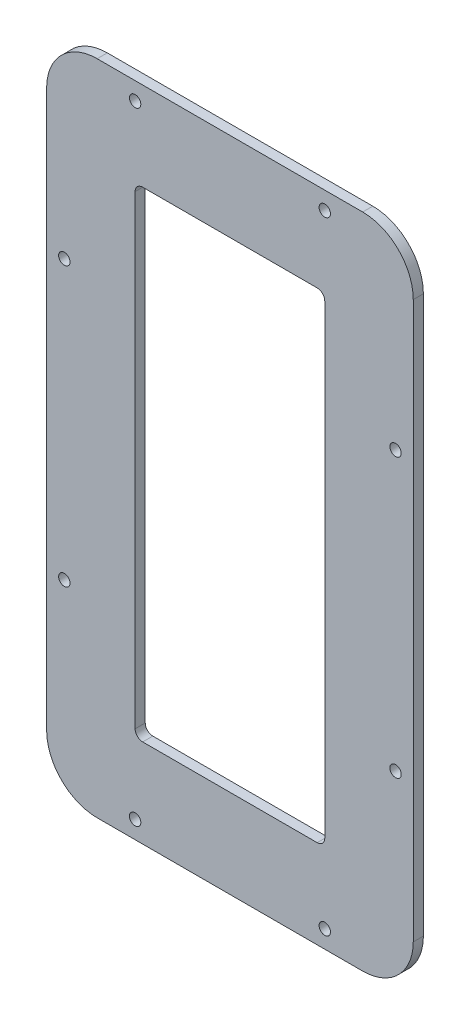
ISO-10303-21;
HEADER;
FILE_DESCRIPTION(('STEP AP214'),'2;1');
FILE_NAME('part.step','',(''),(''),'','','');
FILE_SCHEMA(('AUTOMOTIVE_DESIGN { 1 0 10303 214 1 1 1 1 }'));
ENDSEC;
DATA;
#1=APPLICATION_CONTEXT('core data for automotive mechanical design processes');
#2=APPLICATION_PROTOCOL_DEFINITION('international standard','automotive_design',2000,#1);
#3=PRODUCT_CONTEXT('',#1,'mechanical');
#4=PRODUCT('Part','Part','',(#3));
#5=PRODUCT_RELATED_PRODUCT_CATEGORY('part','',(#4));
#6=PRODUCT_DEFINITION_FORMATION('','',#4);
#7=PRODUCT_DEFINITION_CONTEXT('part definition',#1,'design');
#8=PRODUCT_DEFINITION('design','',#6,#7);
#9=PRODUCT_DEFINITION_SHAPE('','',#8);
#10=(LENGTH_UNIT() NAMED_UNIT(*) SI_UNIT(.MILLI.,.METRE.));
#11=(NAMED_UNIT(*) PLANE_ANGLE_UNIT() SI_UNIT($,.RADIAN.));
#12=(NAMED_UNIT(*) SI_UNIT($,.STERADIAN.) SOLID_ANGLE_UNIT());
#13=UNCERTAINTY_MEASURE_WITH_UNIT(LENGTH_MEASURE(1.E-05),#10,'distance_accuracy_value','');
#14=(GEOMETRIC_REPRESENTATION_CONTEXT(3) GLOBAL_UNCERTAINTY_ASSIGNED_CONTEXT((#13)) GLOBAL_UNIT_ASSIGNED_CONTEXT((#10,
#11,#12)) REPRESENTATION_CONTEXT('',''));
#15=CARTESIAN_POINT('',(0.,0.,0.));
#16=DIRECTION('',(0.,0.,1.));
#17=DIRECTION('',(1.,0.,0.));
#18=AXIS2_PLACEMENT_3D('',#15,#16,#17);
#19=CARTESIAN_POINT('',(72.5,130.,4.));
#20=DIRECTION('',(0.,0.,-1.));
#21=DIRECTION('',(-1.,0.,0.));
#22=AXIS2_PLACEMENT_3D('',#19,#20,#21);
#23=PLANE('',#22);
#24=CARTESIAN_POINT('',(37.5,123.,4.));
#25=DIRECTION('',(0.,0.,1.));
#26=DIRECTION('',(1.,0.,0.));
#27=AXIS2_PLACEMENT_3D('',#24,#25,#26);
#28=CIRCLE('',#27,2.24999999999999);
#29=CARTESIAN_POINT('',(39.75,123.,4.));
#30=VERTEX_POINT('',#29);
#31=EDGE_CURVE('E597',#30,#30,#28,.T.);
#32=ORIENTED_EDGE('',*,*,#31,.F.);
#33=EDGE_LOOP('',(#32));
#34=FACE_BOUND('',#33,.T.);
#35=CARTESIAN_POINT('',(65.5000000000001,-55.,4.));
#36=DIRECTION('',(0.,0.,1.));
#37=DIRECTION('',(1.,0.,0.));
#38=AXIS2_PLACEMENT_3D('',#35,#36,#37);
#39=CIRCLE('',#38,2.24999999999999);
#40=CARTESIAN_POINT('',(67.7500000000001,-55.,4.));
#41=VERTEX_POINT('',#40);
#42=EDGE_CURVE('E585',#41,#41,#39,.T.);
#43=ORIENTED_EDGE('',*,*,#42,.F.);
#44=EDGE_LOOP('',(#43));
#45=FACE_BOUND('',#44,.T.);
#46=CARTESIAN_POINT('',(-37.5,-123.,4.));
#47=DIRECTION('',(0.,0.,1.));
#48=DIRECTION('',(1.,0.,0.));
#49=AXIS2_PLACEMENT_3D('',#46,#47,#48);
#50=CIRCLE('',#49,2.24999999999999);
#51=CARTESIAN_POINT('',(-35.25,-123.,4.));
#52=VERTEX_POINT('',#51);
#53=EDGE_CURVE('E573',#52,#52,#50,.T.);
#54=ORIENTED_EDGE('',*,*,#53,.F.);
#55=EDGE_LOOP('',(#54));
#56=FACE_BOUND('',#55,.T.);
#57=CARTESIAN_POINT('',(-65.5,55.,4.));
#58=DIRECTION('',(0.,0.,1.));
#59=DIRECTION('',(1.,0.,0.));
#60=AXIS2_PLACEMENT_3D('',#57,#58,#59);
#61=CIRCLE('',#60,2.24999999999999);
#62=CARTESIAN_POINT('',(-63.25,55.,4.));
#63=VERTEX_POINT('',#62);
#64=EDGE_CURVE('E558',#63,#63,#61,.T.);
#65=ORIENTED_EDGE('',*,*,#64,.F.);
#66=EDGE_LOOP('',(#65));
#67=FACE_BOUND('',#66,.T.);
#68=DIRECTION('',(1.,0.,0.));
#69=VECTOR('',#68,1.);
#70=CARTESIAN_POINT('',(-72.5,-130.,4.));
#71=LINE('',#70,#69);
#72=CARTESIAN_POINT('',(-52.5,-130.,4.));
#73=VERTEX_POINT('',#72);
#74=CARTESIAN_POINT('',(52.5,-130.,4.));
#75=VERTEX_POINT('',#74);
#76=EDGE_CURVE('E228',#73,#75,#71,.T.);
#77=ORIENTED_EDGE('',*,*,#76,.T.);
#78=CARTESIAN_POINT('',(52.5,-110.,4.));
#79=DIRECTION('',(0.,0.,-1.));
#80=DIRECTION('',(-1.,0.,0.));
#81=AXIS2_PLACEMENT_3D('',#78,#79,#80);
#82=CIRCLE('',#81,20.);
#83=CARTESIAN_POINT('',(72.5,-110.,4.));
#84=VERTEX_POINT('',#83);
#85=EDGE_CURVE('E263',#75,#84,#82,.F.);
#86=ORIENTED_EDGE('',*,*,#85,.T.);
#87=DIRECTION('',(0.,1.,0.));
#88=VECTOR('',#87,1.);
#89=CARTESIAN_POINT('',(72.5,-130.,4.));
#90=LINE('',#89,#88);
#91=CARTESIAN_POINT('',(72.5,110.,4.));
#92=VERTEX_POINT('',#91);
#93=EDGE_CURVE('E220',#84,#92,#90,.T.);
#94=ORIENTED_EDGE('',*,*,#93,.T.);
#95=CARTESIAN_POINT('',(52.5,110.,4.));
#96=DIRECTION('',(0.,0.,-1.));
#97=DIRECTION('',(-1.,0.,0.));
#98=AXIS2_PLACEMENT_3D('',#95,#96,#97);
#99=CIRCLE('',#98,20.);
#100=CARTESIAN_POINT('',(52.5,130.,4.));
#101=VERTEX_POINT('',#100);
#102=EDGE_CURVE('E259',#92,#101,#99,.F.);
#103=ORIENTED_EDGE('',*,*,#102,.T.);
#104=DIRECTION('',(-1.,0.,0.));
#105=VECTOR('',#104,1.);
#106=CARTESIAN_POINT('',(-72.5,130.,4.));
#107=LINE('',#106,#105);
#108=CARTESIAN_POINT('',(-52.5,130.,4.));
#109=VERTEX_POINT('',#108);
#110=EDGE_CURVE('E223',#101,#109,#107,.T.);
#111=ORIENTED_EDGE('',*,*,#110,.T.);
#112=CARTESIAN_POINT('',(-52.5,110.,4.));
#113=DIRECTION('',(0.,0.,-1.));
#114=DIRECTION('',(-1.,0.,0.));
#115=AXIS2_PLACEMENT_3D('',#112,#113,#114);
#116=CIRCLE('',#115,20.);
#117=CARTESIAN_POINT('',(-72.5,110.,4.));
#118=VERTEX_POINT('',#117);
#119=EDGE_CURVE('E53',#109,#118,#116,.F.);
#120=ORIENTED_EDGE('',*,*,#119,.T.);
#121=DIRECTION('',(0.,-1.,0.));
#122=VECTOR('',#121,1.);
#123=CARTESIAN_POINT('',(-72.5,-130.,4.));
#124=LINE('',#123,#122);
#125=CARTESIAN_POINT('',(-72.5,-110.,4.));
#126=VERTEX_POINT('',#125);
#127=EDGE_CURVE('E226',#118,#126,#124,.T.);
#128=ORIENTED_EDGE('',*,*,#127,.T.);
#129=CARTESIAN_POINT('',(-52.5,-110.,4.));
#130=DIRECTION('',(0.,0.,-1.));
#131=DIRECTION('',(-1.,0.,0.));
#132=AXIS2_PLACEMENT_3D('',#129,#130,#131);
#133=CIRCLE('',#132,20.);
#134=EDGE_CURVE('E261',#126,#73,#133,.F.);
#135=ORIENTED_EDGE('',*,*,#134,.T.);
#136=EDGE_LOOP('',(#77,#86,#94,#103,#111,#120,#128,#135));
#137=FACE_BOUND('',#136,.T.);
#138=CARTESIAN_POINT('',(-34.5,92.,4.));
#139=DIRECTION('',(0.,0.,1.));
#140=DIRECTION('',(1.,0.,0.));
#141=AXIS2_PLACEMENT_3D('',#138,#139,#140);
#142=CIRCLE('',#141,3.);
#143=CARTESIAN_POINT('',(-34.5,95.,4.));
#144=VERTEX_POINT('',#143);
#145=CARTESIAN_POINT('',(-37.5,92.,4.));
#146=VERTEX_POINT('',#145);
#147=EDGE_CURVE('E147',#144,#146,#142,.T.);
#148=ORIENTED_EDGE('',*,*,#147,.F.);
#149=DIRECTION('',(-1.,0.,0.));
#150=VECTOR('',#149,1.);
#151=CARTESIAN_POINT('',(-34.5,95.,4.));
#152=LINE('',#151,#150);
#153=CARTESIAN_POINT('',(34.5,95.,4.));
#154=VERTEX_POINT('',#153);
#155=EDGE_CURVE('E185',#154,#144,#152,.T.);
#156=ORIENTED_EDGE('',*,*,#155,.F.);
#157=CARTESIAN_POINT('',(34.5,92.,4.));
#158=DIRECTION('',(0.,0.,1.));
#159=DIRECTION('',(1.,0.,0.));
#160=AXIS2_PLACEMENT_3D('',#157,#158,#159);
#161=CIRCLE('',#160,3.);
#162=CARTESIAN_POINT('',(37.5,92.,4.));
#163=VERTEX_POINT('',#162);
#164=EDGE_CURVE('E182',#163,#154,#161,.T.);
#165=ORIENTED_EDGE('',*,*,#164,.F.);
#166=DIRECTION('',(0.,1.,0.));
#167=VECTOR('',#166,1.);
#168=CARTESIAN_POINT('',(37.5,-92.,4.));
#169=LINE('',#168,#167);
#170=CARTESIAN_POINT('',(37.5,-92.,4.));
#171=VERTEX_POINT('',#170);
#172=EDGE_CURVE('E180',#171,#163,#169,.T.);
#173=ORIENTED_EDGE('',*,*,#172,.F.);
#174=CARTESIAN_POINT('',(34.5,-92.,4.));
#175=DIRECTION('',(0.,0.,1.));
#176=DIRECTION('',(1.,0.,0.));
#177=AXIS2_PLACEMENT_3D('',#174,#175,#176);
#178=CIRCLE('',#177,3.);
#179=CARTESIAN_POINT('',(34.5,-95.,4.));
#180=VERTEX_POINT('',#179);
#181=EDGE_CURVE('E178',#180,#171,#178,.T.);
#182=ORIENTED_EDGE('',*,*,#181,.F.);
#183=DIRECTION('',(1.,0.,0.));
#184=VECTOR('',#183,1.);
#185=CARTESIAN_POINT('',(-34.5,-95.,4.));
#186=LINE('',#185,#184);
#187=CARTESIAN_POINT('',(-34.5,-95.,4.));
#188=VERTEX_POINT('',#187);
#189=EDGE_CURVE('E173',#188,#180,#186,.T.);
#190=ORIENTED_EDGE('',*,*,#189,.F.);
#191=CARTESIAN_POINT('',(-34.5,-92.,4.));
#192=DIRECTION('',(0.,0.,1.));
#193=DIRECTION('',(1.,0.,0.));
#194=AXIS2_PLACEMENT_3D('',#191,#192,#193);
#195=CIRCLE('',#194,3.);
#196=CARTESIAN_POINT('',(-37.5,-92.,4.));
#197=VERTEX_POINT('',#196);
#198=EDGE_CURVE('E171',#197,#188,#195,.T.);
#199=ORIENTED_EDGE('',*,*,#198,.F.);
#200=DIRECTION('',(0.,-1.,0.));
#201=VECTOR('',#200,1.);
#202=CARTESIAN_POINT('',(-37.5,-92.,4.));
#203=LINE('',#202,#201);
#204=EDGE_CURVE('E157',#146,#197,#203,.T.);
#205=ORIENTED_EDGE('',*,*,#204,.F.);
#206=EDGE_LOOP('',(#148,#156,#165,#173,#182,#190,#199,#205));
#207=FACE_BOUND('',#206,.T.);
#208=CARTESIAN_POINT('',(-65.5,-55.,4.));
#209=DIRECTION('',(0.,0.,1.));
#210=DIRECTION('',(1.,0.,0.));
#211=AXIS2_PLACEMENT_3D('',#208,#209,#210);
#212=CIRCLE('',#211,2.24999999999999);
#213=CARTESIAN_POINT('',(-63.25,-55.,4.));
#214=VERTEX_POINT('',#213);
#215=EDGE_CURVE('E567',#214,#214,#212,.T.);
#216=ORIENTED_EDGE('',*,*,#215,.F.);
#217=EDGE_LOOP('',(#216));
#218=FACE_BOUND('',#217,.T.);
#219=CARTESIAN_POINT('',(37.5,-123.,4.));
#220=DIRECTION('',(0.,0.,1.));
#221=DIRECTION('',(1.,0.,0.));
#222=AXIS2_PLACEMENT_3D('',#219,#220,#221);
#223=CIRCLE('',#222,2.24999999999999);
#224=CARTESIAN_POINT('',(39.75,-123.,4.));
#225=VERTEX_POINT('',#224);
#226=EDGE_CURVE('E579',#225,#225,#223,.T.);
#227=ORIENTED_EDGE('',*,*,#226,.F.);
#228=EDGE_LOOP('',(#227));
#229=FACE_BOUND('',#228,.T.);
#230=CARTESIAN_POINT('',(65.5000000000001,55.,4.));
#231=DIRECTION('',(0.,0.,1.));
#232=DIRECTION('',(1.,0.,0.));
#233=AXIS2_PLACEMENT_3D('',#230,#231,#232);
#234=CIRCLE('',#233,2.24999999999999);
#235=CARTESIAN_POINT('',(67.75,55.,4.));
#236=VERTEX_POINT('',#235);
#237=EDGE_CURVE('E591',#236,#236,#234,.T.);
#238=ORIENTED_EDGE('',*,*,#237,.F.);
#239=EDGE_LOOP('',(#238));
#240=FACE_BOUND('',#239,.T.);
#241=CARTESIAN_POINT('',(-37.5,123.,4.));
#242=DIRECTION('',(0.,0.,1.));
#243=DIRECTION('',(1.,0.,0.));
#244=AXIS2_PLACEMENT_3D('',#241,#242,#243);
#245=CIRCLE('',#244,2.24999999999999);
#246=CARTESIAN_POINT('',(-35.25,123.,4.));
#247=VERTEX_POINT('',#246);
#248=EDGE_CURVE('E603',#247,#247,#245,.T.);
#249=ORIENTED_EDGE('',*,*,#248,.F.);
#250=EDGE_LOOP('',(#249));
#251=FACE_BOUND('',#250,.T.);
#252=ADVANCED_FACE('F31',(#34,#45,#56,#67,#137,#207,#218,#229,#240,#251),#23,.F.);
#253=CARTESIAN_POINT('',(72.5,130.,0.));
#254=DIRECTION('',(0.,0.,-1.));
#255=DIRECTION('',(-1.,0.,0.));
#256=AXIS2_PLACEMENT_3D('',#253,#254,#255);
#257=PLANE('',#256);
#258=CARTESIAN_POINT('',(-37.5,123.,0.));
#259=DIRECTION('',(0.,0.,-1.));
#260=DIRECTION('',(-1.,0.,0.));
#261=AXIS2_PLACEMENT_3D('',#258,#259,#260);
#262=CIRCLE('',#261,2.25);
#263=CARTESIAN_POINT('',(-39.75,123.,0.));
#264=VERTEX_POINT('',#263);
#265=EDGE_CURVE('E600',#264,#264,#262,.T.);
#266=ORIENTED_EDGE('',*,*,#265,.F.);
#267=EDGE_LOOP('',(#266));
#268=FACE_BOUND('',#267,.T.);
#269=CARTESIAN_POINT('',(37.5,123.,0.));
#270=DIRECTION('',(0.,0.,-1.));
#271=DIRECTION('',(-1.,0.,0.));
#272=AXIS2_PLACEMENT_3D('',#269,#270,#271);
#273=CIRCLE('',#272,2.25);
#274=CARTESIAN_POINT('',(35.25,123.,0.));
#275=VERTEX_POINT('',#274);
#276=EDGE_CURVE('E594',#275,#275,#273,.T.);
#277=ORIENTED_EDGE('',*,*,#276,.F.);
#278=EDGE_LOOP('',(#277));
#279=FACE_BOUND('',#278,.T.);
#280=CARTESIAN_POINT('',(65.5000000000001,55.,0.));
#281=DIRECTION('',(0.,0.,-1.));
#282=DIRECTION('',(-1.,0.,0.));
#283=AXIS2_PLACEMENT_3D('',#280,#281,#282);
#284=CIRCLE('',#283,2.25);
#285=CARTESIAN_POINT('',(63.2500000000001,55.,0.));
#286=VERTEX_POINT('',#285);
#287=EDGE_CURVE('E588',#286,#286,#284,.T.);
#288=ORIENTED_EDGE('',*,*,#287,.F.);
#289=EDGE_LOOP('',(#288));
#290=FACE_BOUND('',#289,.T.);
#291=CARTESIAN_POINT('',(65.5000000000001,-55.,0.));
#292=DIRECTION('',(0.,0.,-1.));
#293=DIRECTION('',(-1.,0.,0.));
#294=AXIS2_PLACEMENT_3D('',#291,#292,#293);
#295=CIRCLE('',#294,2.25);
#296=CARTESIAN_POINT('',(63.2500000000001,-55.,0.));
#297=VERTEX_POINT('',#296);
#298=EDGE_CURVE('E582',#297,#297,#295,.T.);
#299=ORIENTED_EDGE('',*,*,#298,.F.);
#300=EDGE_LOOP('',(#299));
#301=FACE_BOUND('',#300,.T.);
#302=CARTESIAN_POINT('',(37.5,-123.,0.));
#303=DIRECTION('',(0.,0.,-1.));
#304=DIRECTION('',(-1.,0.,0.));
#305=AXIS2_PLACEMENT_3D('',#302,#303,#304);
#306=CIRCLE('',#305,2.25);
#307=CARTESIAN_POINT('',(35.25,-123.,0.));
#308=VERTEX_POINT('',#307);
#309=EDGE_CURVE('E576',#308,#308,#306,.T.);
#310=ORIENTED_EDGE('',*,*,#309,.F.);
#311=EDGE_LOOP('',(#310));
#312=FACE_BOUND('',#311,.T.);
#313=CARTESIAN_POINT('',(-37.5,-123.,0.));
#314=DIRECTION('',(0.,0.,-1.));
#315=DIRECTION('',(-1.,0.,0.));
#316=AXIS2_PLACEMENT_3D('',#313,#314,#315);
#317=CIRCLE('',#316,2.25);
#318=CARTESIAN_POINT('',(-39.75,-123.,0.));
#319=VERTEX_POINT('',#318);
#320=EDGE_CURVE('E570',#319,#319,#317,.T.);
#321=ORIENTED_EDGE('',*,*,#320,.F.);
#322=EDGE_LOOP('',(#321));
#323=FACE_BOUND('',#322,.T.);
#324=CARTESIAN_POINT('',(-65.5,-55.,0.));
#325=DIRECTION('',(0.,0.,-1.));
#326=DIRECTION('',(-1.,0.,0.));
#327=AXIS2_PLACEMENT_3D('',#324,#325,#326);
#328=CIRCLE('',#327,2.25);
#329=CARTESIAN_POINT('',(-67.75,-55.,0.));
#330=VERTEX_POINT('',#329);
#331=EDGE_CURVE('E562',#330,#330,#328,.T.);
#332=ORIENTED_EDGE('',*,*,#331,.F.);
#333=EDGE_LOOP('',(#332));
#334=FACE_BOUND('',#333,.T.);
#335=CARTESIAN_POINT('',(-65.5,55.,0.));
#336=DIRECTION('',(0.,0.,-1.));
#337=DIRECTION('',(-1.,0.,0.));
#338=AXIS2_PLACEMENT_3D('',#335,#336,#337);
#339=CIRCLE('',#338,2.25);
#340=CARTESIAN_POINT('',(-67.75,55.,0.));
#341=VERTEX_POINT('',#340);
#342=EDGE_CURVE('E189',#341,#341,#339,.T.);
#343=ORIENTED_EDGE('',*,*,#342,.F.);
#344=EDGE_LOOP('',(#343));
#345=FACE_BOUND('',#344,.T.);
#346=DIRECTION('',(0.,1.,0.));
#347=VECTOR('',#346,1.);
#348=CARTESIAN_POINT('',(72.5,-130.,0.));
#349=LINE('',#348,#347);
#350=CARTESIAN_POINT('',(72.5,-110.,0.));
#351=VERTEX_POINT('',#350);
#352=CARTESIAN_POINT('',(72.5,110.,0.));
#353=VERTEX_POINT('',#352);
#354=EDGE_CURVE('E165',#351,#353,#349,.T.);
#355=ORIENTED_EDGE('',*,*,#354,.F.);
#356=CARTESIAN_POINT('',(52.5,-110.,0.));
#357=DIRECTION('',(0.,0.,-1.));
#358=DIRECTION('',(-1.,0.,0.));
#359=AXIS2_PLACEMENT_3D('',#356,#357,#358);
#360=CIRCLE('',#359,20.);
#361=CARTESIAN_POINT('',(52.5,-130.,0.));
#362=VERTEX_POINT('',#361);
#363=EDGE_CURVE('E251',#351,#362,#360,.T.);
#364=ORIENTED_EDGE('',*,*,#363,.T.);
#365=DIRECTION('',(1.,0.,0.));
#366=VECTOR('',#365,1.);
#367=CARTESIAN_POINT('',(-72.5,-130.,0.));
#368=LINE('',#367,#366);
#369=CARTESIAN_POINT('',(-52.5,-130.,0.));
#370=VERTEX_POINT('',#369);
#371=EDGE_CURVE('E224',#370,#362,#368,.T.);
#372=ORIENTED_EDGE('',*,*,#371,.F.);
#373=CARTESIAN_POINT('',(-52.5,-110.,0.));
#374=DIRECTION('',(0.,0.,-1.));
#375=DIRECTION('',(-1.,0.,0.));
#376=AXIS2_PLACEMENT_3D('',#373,#374,#375);
#377=CIRCLE('',#376,20.);
#378=CARTESIAN_POINT('',(-72.5,-110.,0.));
#379=VERTEX_POINT('',#378);
#380=EDGE_CURVE('E249',#370,#379,#377,.T.);
#381=ORIENTED_EDGE('',*,*,#380,.T.);
#382=DIRECTION('',(0.,-1.,0.));
#383=VECTOR('',#382,1.);
#384=CARTESIAN_POINT('',(-72.5,-130.,0.));
#385=LINE('',#384,#383);
#386=CARTESIAN_POINT('',(-72.5,110.,0.));
#387=VERTEX_POINT('',#386);
#388=EDGE_CURVE('E237',#387,#379,#385,.T.);
#389=ORIENTED_EDGE('',*,*,#388,.F.);
#390=CARTESIAN_POINT('',(-52.5,110.,0.));
#391=DIRECTION('',(0.,0.,-1.));
#392=DIRECTION('',(-1.,0.,0.));
#393=AXIS2_PLACEMENT_3D('',#390,#391,#392);
#394=CIRCLE('',#393,20.);
#395=CARTESIAN_POINT('',(-52.5,130.,0.));
#396=VERTEX_POINT('',#395);
#397=EDGE_CURVE('E245',#387,#396,#394,.T.);
#398=ORIENTED_EDGE('',*,*,#397,.T.);
#399=DIRECTION('',(-1.,0.,0.));
#400=VECTOR('',#399,1.);
#401=CARTESIAN_POINT('',(-72.5,130.,0.));
#402=LINE('',#401,#400);
#403=CARTESIAN_POINT('',(52.5,130.,0.));
#404=VERTEX_POINT('',#403);
#405=EDGE_CURVE('E234',#404,#396,#402,.T.);
#406=ORIENTED_EDGE('',*,*,#405,.F.);
#407=CARTESIAN_POINT('',(52.5,110.,0.));
#408=DIRECTION('',(0.,0.,-1.));
#409=DIRECTION('',(-1.,0.,0.));
#410=AXIS2_PLACEMENT_3D('',#407,#408,#409);
#411=CIRCLE('',#410,20.);
#412=EDGE_CURVE('E247',#404,#353,#411,.T.);
#413=ORIENTED_EDGE('',*,*,#412,.T.);
#414=EDGE_LOOP('',(#355,#364,#372,#381,#389,#398,#406,#413));
#415=FACE_BOUND('',#414,.T.);
#416=DIRECTION('',(-1.,0.,0.));
#417=VECTOR('',#416,1.);
#418=CARTESIAN_POINT('',(-34.5,95.,0.));
#419=LINE('',#418,#417);
#420=CARTESIAN_POINT('',(34.5,95.,0.));
#421=VERTEX_POINT('',#420);
#422=CARTESIAN_POINT('',(-34.5,95.,0.));
#423=VERTEX_POINT('',#422);
#424=EDGE_CURVE('E158',#421,#423,#419,.T.);
#425=ORIENTED_EDGE('',*,*,#424,.T.);
#426=CARTESIAN_POINT('',(-34.5,92.,0.));
#427=DIRECTION('',(0.,0.,1.));
#428=DIRECTION('',(1.,0.,0.));
#429=AXIS2_PLACEMENT_3D('',#426,#427,#428);
#430=CIRCLE('',#429,3.);
#431=CARTESIAN_POINT('',(-37.5,92.,0.));
#432=VERTEX_POINT('',#431);
#433=EDGE_CURVE('E187',#423,#432,#430,.T.);
#434=ORIENTED_EDGE('',*,*,#433,.T.);
#435=DIRECTION('',(0.,-1.,0.));
#436=VECTOR('',#435,1.);
#437=CARTESIAN_POINT('',(-37.5,-92.,0.));
#438=LINE('',#437,#436);
#439=CARTESIAN_POINT('',(-37.5,-92.,0.));
#440=VERTEX_POINT('',#439);
#441=EDGE_CURVE('E164',#432,#440,#438,.T.);
#442=ORIENTED_EDGE('',*,*,#441,.T.);
#443=CARTESIAN_POINT('',(-34.5,-92.,0.));
#444=DIRECTION('',(0.,0.,1.));
#445=DIRECTION('',(1.,0.,0.));
#446=AXIS2_PLACEMENT_3D('',#443,#444,#445);
#447=CIRCLE('',#446,3.);
#448=CARTESIAN_POINT('',(-34.5,-95.,0.));
#449=VERTEX_POINT('',#448);
#450=EDGE_CURVE('E191',#440,#449,#447,.T.);
#451=ORIENTED_EDGE('',*,*,#450,.T.);
#452=DIRECTION('',(1.,0.,0.));
#453=VECTOR('',#452,1.);
#454=CARTESIAN_POINT('',(-34.5,-95.,0.));
#455=LINE('',#454,#453);
#456=CARTESIAN_POINT('',(34.5,-95.,0.));
#457=VERTEX_POINT('',#456);
#458=EDGE_CURVE('E194',#449,#457,#455,.T.);
#459=ORIENTED_EDGE('',*,*,#458,.T.);
#460=CARTESIAN_POINT('',(34.5,-92.,0.));
#461=DIRECTION('',(0.,0.,1.));
#462=DIRECTION('',(1.,0.,0.));
#463=AXIS2_PLACEMENT_3D('',#460,#461,#462);
#464=CIRCLE('',#463,3.);
#465=CARTESIAN_POINT('',(37.5,-92.,0.));
#466=VERTEX_POINT('',#465);
#467=EDGE_CURVE('E197',#457,#466,#464,.T.);
#468=ORIENTED_EDGE('',*,*,#467,.T.);
#469=DIRECTION('',(0.,1.,0.));
#470=VECTOR('',#469,1.);
#471=CARTESIAN_POINT('',(37.5,-92.,0.));
#472=LINE('',#471,#470);
#473=CARTESIAN_POINT('',(37.5,92.,0.));
#474=VERTEX_POINT('',#473);
#475=EDGE_CURVE('E200',#466,#474,#472,.T.);
#476=ORIENTED_EDGE('',*,*,#475,.T.);
#477=CARTESIAN_POINT('',(34.5,92.,0.));
#478=DIRECTION('',(0.,0.,1.));
#479=DIRECTION('',(1.,0.,0.));
#480=AXIS2_PLACEMENT_3D('',#477,#478,#479);
#481=CIRCLE('',#480,3.);
#482=EDGE_CURVE('E203',#474,#421,#481,.T.);
#483=ORIENTED_EDGE('',*,*,#482,.T.);
#484=EDGE_LOOP('',(#425,#434,#442,#451,#459,#468,#476,#483));
#485=FACE_BOUND('',#484,.T.);
#486=ADVANCED_FACE('F281',(#268,#279,#290,#301,#312,#323,#334,#345,#415,#485),#257,.T.);
#487=CARTESIAN_POINT('',(72.5,-130.,4.));
#488=DIRECTION('',(-1.,0.,0.));
#489=DIRECTION('',(0.,0.,1.));
#490=AXIS2_PLACEMENT_3D('',#487,#488,#489);
#491=PLANE('',#490);
#492=ORIENTED_EDGE('',*,*,#93,.F.);
#493=DIRECTION('',(0.,0.,-1.));
#494=VECTOR('',#493,1.);
#495=CARTESIAN_POINT('',(72.5,-110.,4.));
#496=LINE('',#495,#494);
#497=EDGE_CURVE('E242',#84,#351,#496,.T.);
#498=ORIENTED_EDGE('',*,*,#497,.T.);
#499=ORIENTED_EDGE('',*,*,#354,.T.);
#500=DIRECTION('',(0.,0.,-1.));
#501=VECTOR('',#500,1.);
#502=CARTESIAN_POINT('',(72.5,110.,4.));
#503=LINE('',#502,#501);
#504=EDGE_CURVE('E231',#353,#92,#503,.F.);
#505=ORIENTED_EDGE('',*,*,#504,.T.);
#506=EDGE_LOOP('',(#492,#498,#499,#505));
#507=FACE_BOUND('',#506,.T.);
#508=ADVANCED_FACE('F298',(#507),#491,.F.);
#509=CARTESIAN_POINT('',(-72.5,130.,4.));
#510=DIRECTION('',(0.,-1.,0.));
#511=DIRECTION('',(0.,0.,-1.));
#512=AXIS2_PLACEMENT_3D('',#509,#510,#511);
#513=PLANE('',#512);
#514=ORIENTED_EDGE('',*,*,#110,.F.);
#515=DIRECTION('',(0.,0.,-1.));
#516=VECTOR('',#515,1.);
#517=CARTESIAN_POINT('',(52.5,130.,4.));
#518=LINE('',#517,#516);
#519=EDGE_CURVE('E11',#101,#404,#518,.T.);
#520=ORIENTED_EDGE('',*,*,#519,.T.);
#521=ORIENTED_EDGE('',*,*,#405,.T.);
#522=DIRECTION('',(0.,0.,-1.));
#523=VECTOR('',#522,1.);
#524=CARTESIAN_POINT('',(-52.5,130.,4.));
#525=LINE('',#524,#523);
#526=EDGE_CURVE('E39',#396,#109,#525,.F.);
#527=ORIENTED_EDGE('',*,*,#526,.T.);
#528=EDGE_LOOP('',(#514,#520,#521,#527));
#529=FACE_BOUND('',#528,.T.);
#530=ADVANCED_FACE('F271',(#529),#513,.F.);
#531=CARTESIAN_POINT('',(-72.5,-130.,4.));
#532=DIRECTION('',(1.,0.,0.));
#533=DIRECTION('',(0.,0.,-1.));
#534=AXIS2_PLACEMENT_3D('',#531,#532,#533);
#535=PLANE('',#534);
#536=ORIENTED_EDGE('',*,*,#388,.T.);
#537=DIRECTION('',(0.,0.,-1.));
#538=VECTOR('',#537,1.);
#539=CARTESIAN_POINT('',(-72.5,-110.,4.));
#540=LINE('',#539,#538);
#541=EDGE_CURVE('E46',#379,#126,#540,.F.);
#542=ORIENTED_EDGE('',*,*,#541,.T.);
#543=ORIENTED_EDGE('',*,*,#127,.F.);
#544=DIRECTION('',(0.,0.,-1.));
#545=VECTOR('',#544,1.);
#546=CARTESIAN_POINT('',(-72.5,110.,4.));
#547=LINE('',#546,#545);
#548=EDGE_CURVE('E265',#118,#387,#547,.T.);
#549=ORIENTED_EDGE('',*,*,#548,.T.);
#550=EDGE_LOOP('',(#536,#542,#543,#549));
#551=FACE_BOUND('',#550,.T.);
#552=ADVANCED_FACE('F278',(#551),#535,.F.);
#553=CARTESIAN_POINT('',(-72.5,-130.,4.));
#554=DIRECTION('',(0.,1.,0.));
#555=DIRECTION('',(0.,0.,1.));
#556=AXIS2_PLACEMENT_3D('',#553,#554,#555);
#557=PLANE('',#556);
#558=ORIENTED_EDGE('',*,*,#371,.T.);
#559=DIRECTION('',(0.,0.,-1.));
#560=VECTOR('',#559,1.);
#561=CARTESIAN_POINT('',(52.5,-130.,4.));
#562=LINE('',#561,#560);
#563=EDGE_CURVE('E256',#362,#75,#562,.F.);
#564=ORIENTED_EDGE('',*,*,#563,.T.);
#565=ORIENTED_EDGE('',*,*,#76,.F.);
#566=DIRECTION('',(0.,0.,-1.));
#567=VECTOR('',#566,1.);
#568=CARTESIAN_POINT('',(-52.5,-130.,4.));
#569=LINE('',#568,#567);
#570=EDGE_CURVE('E253',#73,#370,#569,.T.);
#571=ORIENTED_EDGE('',*,*,#570,.T.);
#572=EDGE_LOOP('',(#558,#564,#565,#571));
#573=FACE_BOUND('',#572,.T.);
#574=ADVANCED_FACE('F290',(#573),#557,.F.);
#575=CARTESIAN_POINT('',(-34.5,92.,4.));
#576=DIRECTION('',(0.,0.,-1.));
#577=DIRECTION('',(-1.,0.,0.));
#578=AXIS2_PLACEMENT_3D('',#575,#576,#577);
#579=CYLINDRICAL_SURFACE('',#578,3.);
#580=ORIENTED_EDGE('',*,*,#433,.F.);
#581=DIRECTION('',(0.,0.,-1.));
#582=VECTOR('',#581,1.);
#583=CARTESIAN_POINT('',(-34.5,95.,4.));
#584=LINE('',#583,#582);
#585=EDGE_CURVE('E153',#144,#423,#584,.T.);
#586=ORIENTED_EDGE('',*,*,#585,.F.);
#587=ORIENTED_EDGE('',*,*,#147,.T.);
#588=DIRECTION('',(0.,0.,-1.));
#589=VECTOR('',#588,1.);
#590=CARTESIAN_POINT('',(-37.5,92.,4.));
#591=LINE('',#590,#589);
#592=EDGE_CURVE('E150',#146,#432,#591,.T.);
#593=ORIENTED_EDGE('',*,*,#592,.T.);
#594=EDGE_LOOP('',(#580,#586,#587,#593));
#595=FACE_BOUND('',#594,.T.);
#596=ADVANCED_FACE('F149',(#595),#579,.F.);
#597=CARTESIAN_POINT('',(-37.5,-92.,4.));
#598=DIRECTION('',(1.,0.,0.));
#599=DIRECTION('',(0.,0.,-1.));
#600=AXIS2_PLACEMENT_3D('',#597,#598,#599);
#601=PLANE('',#600);
#602=ORIENTED_EDGE('',*,*,#441,.F.);
#603=ORIENTED_EDGE('',*,*,#592,.F.);
#604=ORIENTED_EDGE('',*,*,#204,.T.);
#605=DIRECTION('',(0.,0.,-1.));
#606=VECTOR('',#605,1.);
#607=CARTESIAN_POINT('',(-37.5,-92.,4.));
#608=LINE('',#607,#606);
#609=EDGE_CURVE('E166',#197,#440,#608,.T.);
#610=ORIENTED_EDGE('',*,*,#609,.T.);
#611=EDGE_LOOP('',(#602,#603,#604,#610));
#612=FACE_BOUND('',#611,.T.);
#613=ADVANCED_FACE('F161',(#612),#601,.T.);
#614=CARTESIAN_POINT('',(-34.5,-92.,4.));
#615=DIRECTION('',(0.,0.,-1.));
#616=DIRECTION('',(-1.,0.,0.));
#617=AXIS2_PLACEMENT_3D('',#614,#615,#616);
#618=CYLINDRICAL_SURFACE('',#617,3.);
#619=ORIENTED_EDGE('',*,*,#450,.F.);
#620=ORIENTED_EDGE('',*,*,#609,.F.);
#621=ORIENTED_EDGE('',*,*,#198,.T.);
#622=DIRECTION('',(0.,0.,-1.));
#623=VECTOR('',#622,1.);
#624=CARTESIAN_POINT('',(-34.5,-95.,4.));
#625=LINE('',#624,#623);
#626=EDGE_CURVE('E217',#188,#449,#625,.T.);
#627=ORIENTED_EDGE('',*,*,#626,.T.);
#628=EDGE_LOOP('',(#619,#620,#621,#627));
#629=FACE_BOUND('',#628,.T.);
#630=ADVANCED_FACE('F388',(#629),#618,.F.);
#631=CARTESIAN_POINT('',(-34.5,-95.,4.));
#632=DIRECTION('',(0.,1.,0.));
#633=DIRECTION('',(0.,0.,1.));
#634=AXIS2_PLACEMENT_3D('',#631,#632,#633);
#635=PLANE('',#634);
#636=ORIENTED_EDGE('',*,*,#458,.F.);
#637=ORIENTED_EDGE('',*,*,#626,.F.);
#638=ORIENTED_EDGE('',*,*,#189,.T.);
#639=DIRECTION('',(0.,0.,-1.));
#640=VECTOR('',#639,1.);
#641=CARTESIAN_POINT('',(34.5,-95.,4.));
#642=LINE('',#641,#640);
#643=EDGE_CURVE('E215',#180,#457,#642,.T.);
#644=ORIENTED_EDGE('',*,*,#643,.T.);
#645=EDGE_LOOP('',(#636,#637,#638,#644));
#646=FACE_BOUND('',#645,.T.);
#647=ADVANCED_FACE('F384',(#646),#635,.T.);
#648=CARTESIAN_POINT('',(34.5,-92.,4.));
#649=DIRECTION('',(0.,0.,-1.));
#650=DIRECTION('',(-1.,0.,0.));
#651=AXIS2_PLACEMENT_3D('',#648,#649,#650);
#652=CYLINDRICAL_SURFACE('',#651,3.);
#653=ORIENTED_EDGE('',*,*,#467,.F.);
#654=ORIENTED_EDGE('',*,*,#643,.F.);
#655=ORIENTED_EDGE('',*,*,#181,.T.);
#656=DIRECTION('',(0.,0.,-1.));
#657=VECTOR('',#656,1.);
#658=CARTESIAN_POINT('',(37.5,-92.,4.));
#659=LINE('',#658,#657);
#660=EDGE_CURVE('E213',#171,#466,#659,.T.);
#661=ORIENTED_EDGE('',*,*,#660,.T.);
#662=EDGE_LOOP('',(#653,#654,#655,#661));
#663=FACE_BOUND('',#662,.T.);
#664=ADVANCED_FACE('F380',(#663),#652,.F.);
#665=CARTESIAN_POINT('',(37.5,-92.,4.));
#666=DIRECTION('',(-1.,0.,0.));
#667=DIRECTION('',(0.,0.,1.));
#668=AXIS2_PLACEMENT_3D('',#665,#666,#667);
#669=PLANE('',#668);
#670=ORIENTED_EDGE('',*,*,#475,.F.);
#671=ORIENTED_EDGE('',*,*,#660,.F.);
#672=ORIENTED_EDGE('',*,*,#172,.T.);
#673=DIRECTION('',(0.,0.,-1.));
#674=VECTOR('',#673,1.);
#675=CARTESIAN_POINT('',(37.5,92.,4.));
#676=LINE('',#675,#674);
#677=EDGE_CURVE('E211',#163,#474,#676,.T.);
#678=ORIENTED_EDGE('',*,*,#677,.T.);
#679=EDGE_LOOP('',(#670,#671,#672,#678));
#680=FACE_BOUND('',#679,.T.);
#681=ADVANCED_FACE('F376',(#680),#669,.T.);
#682=CARTESIAN_POINT('',(34.5,92.,4.));
#683=DIRECTION('',(0.,0.,-1.));
#684=DIRECTION('',(-1.,0.,0.));
#685=AXIS2_PLACEMENT_3D('',#682,#683,#684);
#686=CYLINDRICAL_SURFACE('',#685,3.);
#687=ORIENTED_EDGE('',*,*,#482,.F.);
#688=ORIENTED_EDGE('',*,*,#677,.F.);
#689=ORIENTED_EDGE('',*,*,#164,.T.);
#690=DIRECTION('',(0.,0.,-1.));
#691=VECTOR('',#690,1.);
#692=CARTESIAN_POINT('',(34.5,95.,4.));
#693=LINE('',#692,#691);
#694=EDGE_CURVE('E209',#154,#421,#693,.T.);
#695=ORIENTED_EDGE('',*,*,#694,.T.);
#696=EDGE_LOOP('',(#687,#688,#689,#695));
#697=FACE_BOUND('',#696,.T.);
#698=ADVANCED_FACE('F372',(#697),#686,.F.);
#699=CARTESIAN_POINT('',(-34.5,95.,4.));
#700=DIRECTION('',(0.,-1.,0.));
#701=DIRECTION('',(0.,0.,-1.));
#702=AXIS2_PLACEMENT_3D('',#699,#700,#701);
#703=PLANE('',#702);
#704=ORIENTED_EDGE('',*,*,#424,.F.);
#705=ORIENTED_EDGE('',*,*,#694,.F.);
#706=ORIENTED_EDGE('',*,*,#155,.T.);
#707=ORIENTED_EDGE('',*,*,#585,.T.);
#708=EDGE_LOOP('',(#704,#705,#706,#707));
#709=FACE_BOUND('',#708,.T.);
#710=ADVANCED_FACE('F368',(#709),#703,.T.);
#711=CARTESIAN_POINT('',(-65.5,55.,4.));
#712=DIRECTION('',(0.,0.,1.));
#713=DIRECTION('',(1.,0.,0.));
#714=AXIS2_PLACEMENT_3D('',#711,#712,#713);
#715=CYLINDRICAL_SURFACE('',#714,2.25);
#716=ORIENTED_EDGE('',*,*,#64,.T.);
#717=EDGE_LOOP('',(#716));
#718=FACE_BOUND('',#717,.T.);
#719=ORIENTED_EDGE('',*,*,#342,.T.);
#720=EDGE_LOOP('',(#719));
#721=FACE_BOUND('',#720,.T.);
#722=ADVANCED_FACE('F364',(#718,#721),#715,.F.);
#723=CARTESIAN_POINT('',(-65.5,-55.,4.));
#724=DIRECTION('',(0.,0.,1.));
#725=DIRECTION('',(1.,0.,0.));
#726=AXIS2_PLACEMENT_3D('',#723,#724,#725);
#727=CYLINDRICAL_SURFACE('',#726,2.25);
#728=ORIENTED_EDGE('',*,*,#215,.T.);
#729=EDGE_LOOP('',(#728));
#730=FACE_BOUND('',#729,.T.);
#731=ORIENTED_EDGE('',*,*,#331,.T.);
#732=EDGE_LOOP('',(#731));
#733=FACE_BOUND('',#732,.T.);
#734=ADVANCED_FACE('F360',(#730,#733),#727,.F.);
#735=CARTESIAN_POINT('',(-37.5,-123.,4.));
#736=DIRECTION('',(0.,0.,1.));
#737=DIRECTION('',(1.,0.,0.));
#738=AXIS2_PLACEMENT_3D('',#735,#736,#737);
#739=CYLINDRICAL_SURFACE('',#738,2.25);
#740=ORIENTED_EDGE('',*,*,#53,.T.);
#741=EDGE_LOOP('',(#740));
#742=FACE_BOUND('',#741,.T.);
#743=ORIENTED_EDGE('',*,*,#320,.T.);
#744=EDGE_LOOP('',(#743));
#745=FACE_BOUND('',#744,.T.);
#746=ADVANCED_FACE('F356',(#742,#745),#739,.F.);
#747=CARTESIAN_POINT('',(37.5,-123.,4.));
#748=DIRECTION('',(0.,0.,1.));
#749=DIRECTION('',(1.,0.,0.));
#750=AXIS2_PLACEMENT_3D('',#747,#748,#749);
#751=CYLINDRICAL_SURFACE('',#750,2.25);
#752=ORIENTED_EDGE('',*,*,#226,.T.);
#753=EDGE_LOOP('',(#752));
#754=FACE_BOUND('',#753,.T.);
#755=ORIENTED_EDGE('',*,*,#309,.T.);
#756=EDGE_LOOP('',(#755));
#757=FACE_BOUND('',#756,.T.);
#758=ADVANCED_FACE('F352',(#754,#757),#751,.F.);
#759=CARTESIAN_POINT('',(65.5000000000001,-55.,4.));
#760=DIRECTION('',(0.,0.,1.));
#761=DIRECTION('',(1.,0.,0.));
#762=AXIS2_PLACEMENT_3D('',#759,#760,#761);
#763=CYLINDRICAL_SURFACE('',#762,2.25);
#764=ORIENTED_EDGE('',*,*,#42,.T.);
#765=EDGE_LOOP('',(#764));
#766=FACE_BOUND('',#765,.T.);
#767=ORIENTED_EDGE('',*,*,#298,.T.);
#768=EDGE_LOOP('',(#767));
#769=FACE_BOUND('',#768,.T.);
#770=ADVANCED_FACE('F348',(#766,#769),#763,.F.);
#771=CARTESIAN_POINT('',(65.5000000000001,55.,4.));
#772=DIRECTION('',(0.,0.,1.));
#773=DIRECTION('',(1.,0.,0.));
#774=AXIS2_PLACEMENT_3D('',#771,#772,#773);
#775=CYLINDRICAL_SURFACE('',#774,2.25);
#776=ORIENTED_EDGE('',*,*,#237,.T.);
#777=EDGE_LOOP('',(#776));
#778=FACE_BOUND('',#777,.T.);
#779=ORIENTED_EDGE('',*,*,#287,.T.);
#780=EDGE_LOOP('',(#779));
#781=FACE_BOUND('',#780,.T.);
#782=ADVANCED_FACE('F340',(#778,#781),#775,.F.);
#783=CARTESIAN_POINT('',(37.5,123.,4.));
#784=DIRECTION('',(0.,0.,1.));
#785=DIRECTION('',(1.,0.,0.));
#786=AXIS2_PLACEMENT_3D('',#783,#784,#785);
#787=CYLINDRICAL_SURFACE('',#786,2.25);
#788=ORIENTED_EDGE('',*,*,#31,.T.);
#789=EDGE_LOOP('',(#788));
#790=FACE_BOUND('',#789,.T.);
#791=ORIENTED_EDGE('',*,*,#276,.T.);
#792=EDGE_LOOP('',(#791));
#793=FACE_BOUND('',#792,.T.);
#794=ADVANCED_FACE('F334',(#790,#793),#787,.F.);
#795=CARTESIAN_POINT('',(-37.5,123.,4.));
#796=DIRECTION('',(0.,0.,1.));
#797=DIRECTION('',(1.,0.,0.));
#798=AXIS2_PLACEMENT_3D('',#795,#796,#797);
#799=CYLINDRICAL_SURFACE('',#798,2.25);
#800=ORIENTED_EDGE('',*,*,#248,.T.);
#801=EDGE_LOOP('',(#800));
#802=FACE_BOUND('',#801,.T.);
#803=ORIENTED_EDGE('',*,*,#265,.T.);
#804=EDGE_LOOP('',(#803));
#805=FACE_BOUND('',#804,.T.);
#806=ADVANCED_FACE('F330',(#802,#805),#799,.F.);
#807=CARTESIAN_POINT('',(52.5,-110.,4.));
#808=DIRECTION('',(0.,0.,-1.));
#809=DIRECTION('',(-1.,0.,0.));
#810=AXIS2_PLACEMENT_3D('',#807,#808,#809);
#811=CYLINDRICAL_SURFACE('',#810,20.);
#812=ORIENTED_EDGE('',*,*,#85,.F.);
#813=ORIENTED_EDGE('',*,*,#563,.F.);
#814=ORIENTED_EDGE('',*,*,#363,.F.);
#815=ORIENTED_EDGE('',*,*,#497,.F.);
#816=EDGE_LOOP('',(#812,#813,#814,#815));
#817=FACE_BOUND('',#816,.T.);
#818=ADVANCED_FACE('F296',(#817),#811,.T.);
#819=CARTESIAN_POINT('',(-52.5,-110.,4.));
#820=DIRECTION('',(0.,0.,-1.));
#821=DIRECTION('',(-1.,0.,0.));
#822=AXIS2_PLACEMENT_3D('',#819,#820,#821);
#823=CYLINDRICAL_SURFACE('',#822,20.);
#824=ORIENTED_EDGE('',*,*,#134,.F.);
#825=ORIENTED_EDGE('',*,*,#541,.F.);
#826=ORIENTED_EDGE('',*,*,#380,.F.);
#827=ORIENTED_EDGE('',*,*,#570,.F.);
#828=EDGE_LOOP('',(#824,#825,#826,#827));
#829=FACE_BOUND('',#828,.T.);
#830=ADVANCED_FACE('F287',(#829),#823,.T.);
#831=CARTESIAN_POINT('',(52.5,110.,4.));
#832=DIRECTION('',(0.,0.,-1.));
#833=DIRECTION('',(-1.,0.,0.));
#834=AXIS2_PLACEMENT_3D('',#831,#832,#833);
#835=CYLINDRICAL_SURFACE('',#834,20.);
#836=ORIENTED_EDGE('',*,*,#102,.F.);
#837=ORIENTED_EDGE('',*,*,#504,.F.);
#838=ORIENTED_EDGE('',*,*,#412,.F.);
#839=ORIENTED_EDGE('',*,*,#519,.F.);
#840=EDGE_LOOP('',(#836,#837,#838,#839));
#841=FACE_BOUND('',#840,.T.);
#842=ADVANCED_FACE('F301',(#841),#835,.T.);
#843=CARTESIAN_POINT('',(-52.5,110.,4.));
#844=DIRECTION('',(0.,0.,-1.));
#845=DIRECTION('',(-1.,0.,0.));
#846=AXIS2_PLACEMENT_3D('',#843,#844,#845);
#847=CYLINDRICAL_SURFACE('',#846,20.);
#848=ORIENTED_EDGE('',*,*,#119,.F.);
#849=ORIENTED_EDGE('',*,*,#526,.F.);
#850=ORIENTED_EDGE('',*,*,#397,.F.);
#851=ORIENTED_EDGE('',*,*,#548,.F.);
#852=EDGE_LOOP('',(#848,#849,#850,#851));
#853=FACE_BOUND('',#852,.T.);
#854=ADVANCED_FACE('F33',(#853),#847,.T.);
#855=CLOSED_SHELL('',(#252,#486,#508,#530,#552,#574,#596,#613,#630,#647,#664,#681,#698,#710,
#722,#734,#746,#758,#770,#782,#794,#806,#818,#830,#842,#854));
#856=MANIFOLD_SOLID_BREP('B2',#855);
#857=ADVANCED_BREP_SHAPE_REPRESENTATION('',(#18,#856),#14);
#858=SHAPE_DEFINITION_REPRESENTATION(#9,#857);
ENDSEC;
END-ISO-10303-21;
